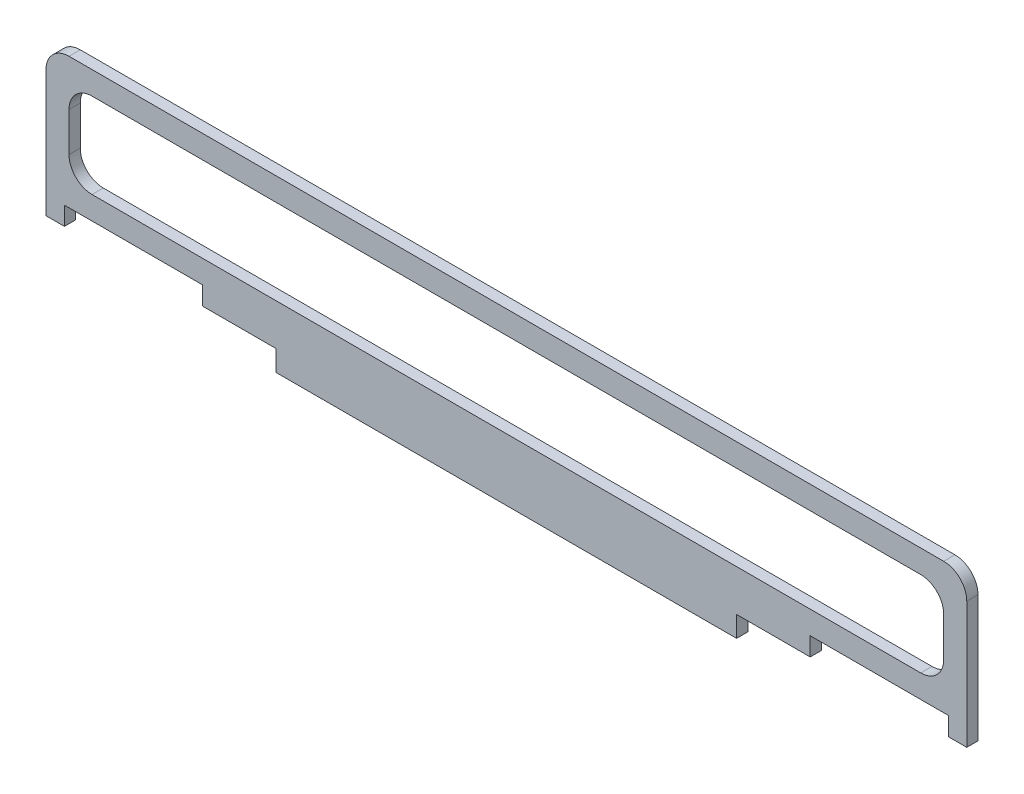
ISO-10303-21;
HEADER;
FILE_DESCRIPTION(('STEP AP214'),'2;1');
FILE_NAME('part.step','',(''),(''),'','','');
FILE_SCHEMA(('AUTOMOTIVE_DESIGN { 1 0 10303 214 1 1 1 1 }'));
ENDSEC;
DATA;
#1=APPLICATION_CONTEXT('core data for automotive mechanical design processes');
#2=APPLICATION_PROTOCOL_DEFINITION('international standard','automotive_design',2000,#1);
#3=PRODUCT_CONTEXT('',#1,'mechanical');
#4=PRODUCT('Part','Part','',(#3));
#5=PRODUCT_RELATED_PRODUCT_CATEGORY('part','',(#4));
#6=PRODUCT_DEFINITION_FORMATION('','',#4);
#7=PRODUCT_DEFINITION_CONTEXT('part definition',#1,'design');
#8=PRODUCT_DEFINITION('design','',#6,#7);
#9=PRODUCT_DEFINITION_SHAPE('','',#8);
#10=(LENGTH_UNIT() NAMED_UNIT(*) SI_UNIT(.MILLI.,.METRE.));
#11=(NAMED_UNIT(*) PLANE_ANGLE_UNIT() SI_UNIT($,.RADIAN.));
#12=(NAMED_UNIT(*) SI_UNIT($,.STERADIAN.) SOLID_ANGLE_UNIT());
#13=UNCERTAINTY_MEASURE_WITH_UNIT(LENGTH_MEASURE(1.E-05),#10,'distance_accuracy_value','');
#14=(GEOMETRIC_REPRESENTATION_CONTEXT(3) GLOBAL_UNCERTAINTY_ASSIGNED_CONTEXT((#13)) GLOBAL_UNIT_ASSIGNED_CONTEXT((#10,
#11,#12)) REPRESENTATION_CONTEXT('',''));
#15=CARTESIAN_POINT('',(0.,0.,0.));
#16=DIRECTION('',(0.,0.,1.));
#17=DIRECTION('',(1.,0.,0.));
#18=AXIS2_PLACEMENT_3D('',#15,#16,#17);
#19=CARTESIAN_POINT('',(127.,-17.78,0.));
#20=DIRECTION('',(0.,1.,0.));
#21=DIRECTION('',(0.,0.,1.));
#22=AXIS2_PLACEMENT_3D('',#19,#20,#21);
#23=PLANE('',#22);
#24=DIRECTION('',(-1.,0.,0.));
#25=VECTOR('',#24,1.);
#26=CARTESIAN_POINT('',(127.,-17.78,0.));
#27=LINE('',#26,#25);
#28=CARTESIAN_POINT('',(83.82,-17.78,0.));
#29=VERTEX_POINT('',#28);
#30=CARTESIAN_POINT('',(63.5,-17.78,0.));
#31=VERTEX_POINT('',#30);
#32=EDGE_CURVE('E260',#29,#31,#27,.T.);
#33=ORIENTED_EDGE('',*,*,#32,.F.);
#34=DIRECTION('',(0.,0.,1.));
#35=VECTOR('',#34,1.);
#36=CARTESIAN_POINT('',(83.82,-17.78,0.));
#37=LINE('',#36,#35);
#38=CARTESIAN_POINT('',(83.82,-17.78,3.0988));
#39=VERTEX_POINT('',#38);
#40=EDGE_CURVE('E388',#29,#39,#37,.T.);
#41=ORIENTED_EDGE('',*,*,#40,.T.);
#42=DIRECTION('',(-1.,0.,0.));
#43=VECTOR('',#42,1.);
#44=CARTESIAN_POINT('',(127.,-17.78,3.0988));
#45=LINE('',#44,#43);
#46=CARTESIAN_POINT('',(63.5,-17.78,3.0988));
#47=VERTEX_POINT('',#46);
#48=EDGE_CURVE('E268',#39,#47,#45,.T.);
#49=ORIENTED_EDGE('',*,*,#48,.T.);
#50=DIRECTION('',(0.,0.,1.));
#51=VECTOR('',#50,1.);
#52=CARTESIAN_POINT('',(63.5,-17.78,0.));
#53=LINE('',#52,#51);
#54=EDGE_CURVE('E272',#31,#47,#53,.T.);
#55=ORIENTED_EDGE('',*,*,#54,.F.);
#56=EDGE_LOOP('',(#33,#41,#49,#55));
#57=FACE_BOUND('',#56,.T.);
#58=ADVANCED_FACE('F33',(#57),#23,.F.);
#59=CARTESIAN_POINT('',(-127.,-17.78,0.));
#60=DIRECTION('',(0.,1.,0.));
#61=DIRECTION('',(0.,0.,1.));
#62=AXIS2_PLACEMENT_3D('',#59,#60,#61);
#63=PLANE('',#62);
#64=DIRECTION('',(-1.,0.,0.));
#65=VECTOR('',#64,1.);
#66=CARTESIAN_POINT('',(-127.,-17.78,0.));
#67=LINE('',#66,#65);
#68=CARTESIAN_POINT('',(-121.92,-17.78,0.));
#69=VERTEX_POINT('',#68);
#70=CARTESIAN_POINT('',(-127.,-17.78,0.));
#71=VERTEX_POINT('',#70);
#72=EDGE_CURVE('E223',#69,#71,#67,.T.);
#73=ORIENTED_EDGE('',*,*,#72,.F.);
#74=DIRECTION('',(0.,0.,1.));
#75=VECTOR('',#74,1.);
#76=CARTESIAN_POINT('',(-121.92,-17.78,0.));
#77=LINE('',#76,#75);
#78=CARTESIAN_POINT('',(-121.92,-17.78,3.0988));
#79=VERTEX_POINT('',#78);
#80=EDGE_CURVE('E207',#69,#79,#77,.T.);
#81=ORIENTED_EDGE('',*,*,#80,.T.);
#82=DIRECTION('',(-1.,0.,0.));
#83=VECTOR('',#82,1.);
#84=CARTESIAN_POINT('',(-127.,-17.78,3.0988));
#85=LINE('',#84,#83);
#86=CARTESIAN_POINT('',(-127.,-17.78,3.0988));
#87=VERTEX_POINT('',#86);
#88=EDGE_CURVE('E247',#79,#87,#85,.T.);
#89=ORIENTED_EDGE('',*,*,#88,.T.);
#90=DIRECTION('',(0.,0.,1.));
#91=VECTOR('',#90,1.);
#92=CARTESIAN_POINT('',(-127.,-17.78,0.));
#93=LINE('',#92,#91);
#94=EDGE_CURVE('E232',#71,#87,#93,.T.);
#95=ORIENTED_EDGE('',*,*,#94,.F.);
#96=EDGE_LOOP('',(#73,#81,#89,#95));
#97=FACE_BOUND('',#96,.T.);
#98=ADVANCED_FACE('F230',(#97),#63,.F.);
#99=CARTESIAN_POINT('',(127.,23.495,3.0988));
#100=DIRECTION('',(-1.,0.,0.));
#101=DIRECTION('',(0.,0.,1.));
#102=AXIS2_PLACEMENT_3D('',#99,#100,#101);
#103=PLANE('',#102);
#104=DIRECTION('',(0.,1.,0.));
#105=VECTOR('',#104,1.);
#106=CARTESIAN_POINT('',(127.,23.495,3.0988));
#107=LINE('',#106,#105);
#108=CARTESIAN_POINT('',(127.,-17.78,3.0988));
#109=VERTEX_POINT('',#108);
#110=CARTESIAN_POINT('',(127.,17.145,3.0988));
#111=VERTEX_POINT('',#110);
#112=EDGE_CURVE('E276',#109,#111,#107,.T.);
#113=ORIENTED_EDGE('',*,*,#112,.F.);
#114=DIRECTION('',(0.,0.,1.));
#115=VECTOR('',#114,1.);
#116=CARTESIAN_POINT('',(127.,-17.78,0.));
#117=LINE('',#116,#115);
#118=CARTESIAN_POINT('',(127.,-17.78,0.));
#119=VERTEX_POINT('',#118);
#120=EDGE_CURVE('E263',#119,#109,#117,.T.);
#121=ORIENTED_EDGE('',*,*,#120,.F.);
#122=DIRECTION('',(0.,1.,0.));
#123=VECTOR('',#122,1.);
#124=CARTESIAN_POINT('',(127.,23.495,0.));
#125=LINE('',#124,#123);
#126=CARTESIAN_POINT('',(127.,17.145,0.));
#127=VERTEX_POINT('',#126);
#128=EDGE_CURVE('E252',#119,#127,#125,.T.);
#129=ORIENTED_EDGE('',*,*,#128,.T.);
#130=DIRECTION('',(0.,0.,-1.));
#131=VECTOR('',#130,1.);
#132=CARTESIAN_POINT('',(127.,17.145,3.0988));
#133=LINE('',#132,#131);
#134=EDGE_CURVE('E306',#127,#111,#133,.F.);
#135=ORIENTED_EDGE('',*,*,#134,.T.);
#136=EDGE_LOOP('',(#113,#121,#129,#135));
#137=FACE_BOUND('',#136,.T.);
#138=ADVANCED_FACE('F433',(#137),#103,.F.);
#139=CARTESIAN_POINT('',(-127.,23.495,3.0988));
#140=DIRECTION('',(0.,-1.,0.));
#141=DIRECTION('',(0.,0.,-1.));
#142=AXIS2_PLACEMENT_3D('',#139,#140,#141);
#143=PLANE('',#142);
#144=DIRECTION('',(-1.,0.,0.));
#145=VECTOR('',#144,1.);
#146=CARTESIAN_POINT('',(-127.,23.495,3.0988));
#147=LINE('',#146,#145);
#148=CARTESIAN_POINT('',(120.65,23.495,3.0988));
#149=VERTEX_POINT('',#148);
#150=CARTESIAN_POINT('',(-120.65,23.495,3.0988));
#151=VERTEX_POINT('',#150);
#152=EDGE_CURVE('E278',#149,#151,#147,.T.);
#153=ORIENTED_EDGE('',*,*,#152,.F.);
#154=DIRECTION('',(0.,0.,-1.));
#155=VECTOR('',#154,1.);
#156=CARTESIAN_POINT('',(120.65,23.495,3.0988));
#157=LINE('',#156,#155);
#158=CARTESIAN_POINT('',(120.65,23.495,0.));
#159=VERTEX_POINT('',#158);
#160=EDGE_CURVE('E298',#149,#159,#157,.T.);
#161=ORIENTED_EDGE('',*,*,#160,.T.);
#162=DIRECTION('',(-1.,0.,0.));
#163=VECTOR('',#162,1.);
#164=CARTESIAN_POINT('',(-127.,23.495,0.));
#165=LINE('',#164,#163);
#166=CARTESIAN_POINT('',(-120.65,23.495,0.));
#167=VERTEX_POINT('',#166);
#168=EDGE_CURVE('E290',#159,#167,#165,.T.);
#169=ORIENTED_EDGE('',*,*,#168,.T.);
#170=DIRECTION('',(0.,0.,-1.));
#171=VECTOR('',#170,1.);
#172=CARTESIAN_POINT('',(-120.65,23.495,3.0988));
#173=LINE('',#172,#171);
#174=EDGE_CURVE('E288',#167,#151,#173,.F.);
#175=ORIENTED_EDGE('',*,*,#174,.T.);
#176=EDGE_LOOP('',(#153,#161,#169,#175));
#177=FACE_BOUND('',#176,.T.);
#178=ADVANCED_FACE('F443',(#177),#143,.F.);
#179=CARTESIAN_POINT('',(-127.,23.495,3.0988));
#180=DIRECTION('',(1.,0.,0.));
#181=DIRECTION('',(0.,0.,-1.));
#182=AXIS2_PLACEMENT_3D('',#179,#180,#181);
#183=PLANE('',#182);
#184=DIRECTION('',(0.,-1.,0.));
#185=VECTOR('',#184,1.);
#186=CARTESIAN_POINT('',(-127.,23.495,0.));
#187=LINE('',#186,#185);
#188=CARTESIAN_POINT('',(-127.,17.145,0.));
#189=VERTEX_POINT('',#188);
#190=EDGE_CURVE('E293',#189,#71,#187,.T.);
#191=ORIENTED_EDGE('',*,*,#190,.T.);
#192=ORIENTED_EDGE('',*,*,#94,.T.);
#193=DIRECTION('',(0.,-1.,0.));
#194=VECTOR('',#193,1.);
#195=CARTESIAN_POINT('',(-127.,23.495,3.0988));
#196=LINE('',#195,#194);
#197=CARTESIAN_POINT('',(-127.,17.145,3.0988));
#198=VERTEX_POINT('',#197);
#199=EDGE_CURVE('E282',#198,#87,#196,.T.);
#200=ORIENTED_EDGE('',*,*,#199,.F.);
#201=DIRECTION('',(0.,0.,-1.));
#202=VECTOR('',#201,1.);
#203=CARTESIAN_POINT('',(-127.,17.145,3.0988));
#204=LINE('',#203,#202);
#205=EDGE_CURVE('E313',#198,#189,#204,.T.);
#206=ORIENTED_EDGE('',*,*,#205,.T.);
#207=EDGE_LOOP('',(#191,#192,#200,#206));
#208=FACE_BOUND('',#207,.T.);
#209=ADVANCED_FACE('F450',(#208),#183,.F.);
#210=CARTESIAN_POINT('',(-127.,-23.495,3.0988));
#211=DIRECTION('',(0.,1.,0.));
#212=DIRECTION('',(0.,0.,1.));
#213=AXIS2_PLACEMENT_3D('',#210,#211,#212);
#214=PLANE('',#213);
#215=DIRECTION('',(1.,0.,0.));
#216=VECTOR('',#215,1.);
#217=CARTESIAN_POINT('',(-127.,-23.495,3.0988));
#218=LINE('',#217,#216);
#219=CARTESIAN_POINT('',(-63.5,-23.495,3.0988));
#220=VERTEX_POINT('',#219);
#221=CARTESIAN_POINT('',(63.5,-23.495,3.0988));
#222=VERTEX_POINT('',#221);
#223=EDGE_CURVE('E285',#220,#222,#218,.T.);
#224=ORIENTED_EDGE('',*,*,#223,.F.);
#225=DIRECTION('',(0.,0.,1.));
#226=VECTOR('',#225,1.);
#227=CARTESIAN_POINT('',(-63.5,-23.495,0.));
#228=LINE('',#227,#226);
#229=CARTESIAN_POINT('',(-63.5,-23.495,0.));
#230=VERTEX_POINT('',#229);
#231=EDGE_CURVE('E238',#230,#220,#228,.T.);
#232=ORIENTED_EDGE('',*,*,#231,.F.);
#233=DIRECTION('',(1.,0.,0.));
#234=VECTOR('',#233,1.);
#235=CARTESIAN_POINT('',(-127.,-23.495,0.));
#236=LINE('',#235,#234);
#237=CARTESIAN_POINT('',(63.5,-23.495,0.));
#238=VERTEX_POINT('',#237);
#239=EDGE_CURVE('E279',#230,#238,#236,.T.);
#240=ORIENTED_EDGE('',*,*,#239,.T.);
#241=DIRECTION('',(0.,0.,1.));
#242=VECTOR('',#241,1.);
#243=CARTESIAN_POINT('',(63.5,-23.495,0.));
#244=LINE('',#243,#242);
#245=EDGE_CURVE('E248',#238,#222,#244,.T.);
#246=ORIENTED_EDGE('',*,*,#245,.T.);
#247=EDGE_LOOP('',(#224,#232,#240,#246));
#248=FACE_BOUND('',#247,.T.);
#249=ADVANCED_FACE('F452',(#248),#214,.F.);
#250=CARTESIAN_POINT('',(0.,0.,3.0988));
#251=DIRECTION('',(0.,0.,1.));
#252=DIRECTION('',(1.,0.,0.));
#253=AXIS2_PLACEMENT_3D('',#250,#251,#252);
#254=PLANE('',#253);
#255=DIRECTION('',(-1.,0.,0.));
#256=VECTOR('',#255,1.);
#257=CARTESIAN_POINT('',(120.65,17.145,3.0988));
#258=LINE('',#257,#256);
#259=CARTESIAN_POINT('',(114.3,17.145,3.0988));
#260=VERTEX_POINT('',#259);
#261=CARTESIAN_POINT('',(-114.3,17.145,3.0988));
#262=VERTEX_POINT('',#261);
#263=EDGE_CURVE('E358',#260,#262,#258,.T.);
#264=ORIENTED_EDGE('',*,*,#263,.F.);
#265=CARTESIAN_POINT('',(114.3,10.795,3.0988));
#266=DIRECTION('',(0.,0.,1.));
#267=DIRECTION('',(1.,0.,0.));
#268=AXIS2_PLACEMENT_3D('',#265,#266,#267);
#269=CIRCLE('',#268,6.35);
#270=CARTESIAN_POINT('',(120.65,10.795,3.0988));
#271=VERTEX_POINT('',#270);
#272=EDGE_CURVE('E339',#260,#271,#269,.F.);
#273=ORIENTED_EDGE('',*,*,#272,.T.);
#274=DIRECTION('',(0.,1.,0.));
#275=VECTOR('',#274,1.);
#276=CARTESIAN_POINT('',(120.65,-6.35,3.0988));
#277=LINE('',#276,#275);
#278=CARTESIAN_POINT('',(120.65,0.,3.0988));
#279=VERTEX_POINT('',#278);
#280=EDGE_CURVE('E381',#279,#271,#277,.T.);
#281=ORIENTED_EDGE('',*,*,#280,.F.);
#282=CARTESIAN_POINT('',(114.3,0.,3.0988));
#283=DIRECTION('',(0.,0.,1.));
#284=DIRECTION('',(1.,0.,0.));
#285=AXIS2_PLACEMENT_3D('',#282,#283,#284);
#286=CIRCLE('',#285,6.35);
#287=CARTESIAN_POINT('',(114.3,-6.35,3.0988));
#288=VERTEX_POINT('',#287);
#289=EDGE_CURVE('E335',#279,#288,#286,.F.);
#290=ORIENTED_EDGE('',*,*,#289,.T.);
#291=DIRECTION('',(1.,0.,0.));
#292=VECTOR('',#291,1.);
#293=CARTESIAN_POINT('',(77.47,-6.35,3.0988));
#294=LINE('',#293,#292);
#295=CARTESIAN_POINT('',(-114.3,-6.35,3.0988));
#296=VERTEX_POINT('',#295);
#297=EDGE_CURVE('E353',#296,#288,#294,.T.);
#298=ORIENTED_EDGE('',*,*,#297,.F.);
#299=CARTESIAN_POINT('',(-114.3,0.,3.0988));
#300=DIRECTION('',(0.,0.,1.));
#301=DIRECTION('',(1.,0.,0.));
#302=AXIS2_PLACEMENT_3D('',#299,#300,#301);
#303=CIRCLE('',#302,6.35);
#304=CARTESIAN_POINT('',(-120.65,0.,3.0988));
#305=VERTEX_POINT('',#304);
#306=EDGE_CURVE('E41',#296,#305,#303,.F.);
#307=ORIENTED_EDGE('',*,*,#306,.T.);
#308=DIRECTION('',(0.,-1.,0.));
#309=VECTOR('',#308,1.);
#310=CARTESIAN_POINT('',(-120.65,17.145,3.0988));
#311=LINE('',#310,#309);
#312=CARTESIAN_POINT('',(-120.65,10.795,3.0988));
#313=VERTEX_POINT('',#312);
#314=EDGE_CURVE('E351',#313,#305,#311,.T.);
#315=ORIENTED_EDGE('',*,*,#314,.F.);
#316=CARTESIAN_POINT('',(-114.3,10.795,3.0988));
#317=DIRECTION('',(0.,0.,1.));
#318=DIRECTION('',(1.,0.,0.));
#319=AXIS2_PLACEMENT_3D('',#316,#317,#318);
#320=CIRCLE('',#319,6.35);
#321=EDGE_CURVE('E343',#313,#262,#320,.F.);
#322=ORIENTED_EDGE('',*,*,#321,.T.);
#323=EDGE_LOOP('',(#264,#273,#281,#290,#298,#307,#315,#322));
#324=FACE_BOUND('',#323,.T.);
#325=DIRECTION('',(0.,-1.,0.));
#326=VECTOR('',#325,1.);
#327=CARTESIAN_POINT('',(-121.92,-17.78,3.0988));
#328=LINE('',#327,#326);
#329=CARTESIAN_POINT('',(-121.92,-12.7,3.0988));
#330=VERTEX_POINT('',#329);
#331=EDGE_CURVE('E213',#330,#79,#328,.T.);
#332=ORIENTED_EDGE('',*,*,#331,.F.);
#333=DIRECTION('',(-1.,0.,0.));
#334=VECTOR('',#333,1.);
#335=CARTESIAN_POINT('',(-121.92,-12.7,3.0988));
#336=LINE('',#335,#334);
#337=CARTESIAN_POINT('',(-83.82,-12.7,3.0988));
#338=VERTEX_POINT('',#337);
#339=EDGE_CURVE('E228',#338,#330,#336,.T.);
#340=ORIENTED_EDGE('',*,*,#339,.F.);
#341=DIRECTION('',(0.,1.,0.));
#342=VECTOR('',#341,1.);
#343=CARTESIAN_POINT('',(-83.82,-17.78,3.0988));
#344=LINE('',#343,#342);
#345=CARTESIAN_POINT('',(-83.82,-17.78,3.0988));
#346=VERTEX_POINT('',#345);
#347=EDGE_CURVE('E387',#346,#338,#344,.T.);
#348=ORIENTED_EDGE('',*,*,#347,.F.);
#349=CARTESIAN_POINT('',(-63.5,-17.78,3.0988));
#350=VERTEX_POINT('',#349);
#351=EDGE_CURVE('E240',#350,#346,#85,.T.);
#352=ORIENTED_EDGE('',*,*,#351,.F.);
#353=DIRECTION('',(0.,1.,0.));
#354=VECTOR('',#353,1.);
#355=CARTESIAN_POINT('',(-63.5,-23.495,3.0988));
#356=LINE('',#355,#354);
#357=EDGE_CURVE('E244',#220,#350,#356,.T.);
#358=ORIENTED_EDGE('',*,*,#357,.F.);
#359=ORIENTED_EDGE('',*,*,#223,.T.);
#360=DIRECTION('',(0.,-1.,0.));
#361=VECTOR('',#360,1.);
#362=CARTESIAN_POINT('',(63.5,-23.495,3.0988));
#363=LINE('',#362,#361);
#364=EDGE_CURVE('E267',#47,#222,#363,.T.);
#365=ORIENTED_EDGE('',*,*,#364,.F.);
#366=ORIENTED_EDGE('',*,*,#48,.F.);
#367=DIRECTION('',(0.,-1.,0.));
#368=VECTOR('',#367,1.);
#369=CARTESIAN_POINT('',(83.82,-17.78,3.0988));
#370=LINE('',#369,#368);
#371=CARTESIAN_POINT('',(83.82,-12.7,3.0988));
#372=VERTEX_POINT('',#371);
#373=EDGE_CURVE('E402',#372,#39,#370,.T.);
#374=ORIENTED_EDGE('',*,*,#373,.F.);
#375=DIRECTION('',(-1.,0.,0.));
#376=VECTOR('',#375,1.);
#377=CARTESIAN_POINT('',(121.92,-12.7,3.0988));
#378=LINE('',#377,#376);
#379=CARTESIAN_POINT('',(121.92,-12.7,3.0988));
#380=VERTEX_POINT('',#379);
#381=EDGE_CURVE('E411',#380,#372,#378,.T.);
#382=ORIENTED_EDGE('',*,*,#381,.F.);
#383=DIRECTION('',(0.,1.,0.));
#384=VECTOR('',#383,1.);
#385=CARTESIAN_POINT('',(121.92,-17.78,3.0988));
#386=LINE('',#385,#384);
#387=CARTESIAN_POINT('',(121.92,-17.78,3.0988));
#388=VERTEX_POINT('',#387);
#389=EDGE_CURVE('E372',#388,#380,#386,.T.);
#390=ORIENTED_EDGE('',*,*,#389,.F.);
#391=EDGE_CURVE('E264',#109,#388,#45,.T.);
#392=ORIENTED_EDGE('',*,*,#391,.F.);
#393=ORIENTED_EDGE('',*,*,#112,.T.);
#394=CARTESIAN_POINT('',(120.65,17.145,3.0988));
#395=DIRECTION('',(0.,0.,1.));
#396=DIRECTION('',(1.,0.,0.));
#397=AXIS2_PLACEMENT_3D('',#394,#395,#396);
#398=CIRCLE('',#397,6.35);
#399=EDGE_CURVE('E311',#111,#149,#398,.T.);
#400=ORIENTED_EDGE('',*,*,#399,.T.);
#401=ORIENTED_EDGE('',*,*,#152,.T.);
#402=CARTESIAN_POINT('',(-120.65,17.145,3.0988));
#403=DIRECTION('',(0.,0.,1.));
#404=DIRECTION('',(1.,0.,0.));
#405=AXIS2_PLACEMENT_3D('',#402,#403,#404);
#406=CIRCLE('',#405,6.35);
#407=EDGE_CURVE('E309',#151,#198,#406,.T.);
#408=ORIENTED_EDGE('',*,*,#407,.T.);
#409=ORIENTED_EDGE('',*,*,#199,.T.);
#410=ORIENTED_EDGE('',*,*,#88,.F.);
#411=EDGE_LOOP('',(#332,#340,#348,#352,#358,#359,#365,#366,#374,#382,#390,#392,#393,#400,#401,
#408,#409,#410));
#412=FACE_BOUND('',#411,.T.);
#413=ADVANCED_FACE('F349',(#324,#412),#254,.T.);
#414=CARTESIAN_POINT('',(0.,0.,0.));
#415=DIRECTION('',(0.,0.,1.));
#416=DIRECTION('',(1.,0.,0.));
#417=AXIS2_PLACEMENT_3D('',#414,#415,#416);
#418=PLANE('',#417);
#419=DIRECTION('',(1.,0.,0.));
#420=VECTOR('',#419,1.);
#421=CARTESIAN_POINT('',(-120.65,-6.35,0.));
#422=LINE('',#421,#420);
#423=CARTESIAN_POINT('',(-114.3,-6.35,0.));
#424=VERTEX_POINT('',#423);
#425=CARTESIAN_POINT('',(114.3,-6.34999999999999,0.));
#426=VERTEX_POINT('',#425);
#427=EDGE_CURVE('E363',#424,#426,#422,.T.);
#428=ORIENTED_EDGE('',*,*,#427,.T.);
#429=CARTESIAN_POINT('',(114.3,0.,0.));
#430=DIRECTION('',(0.,0.,1.));
#431=DIRECTION('',(1.,0.,0.));
#432=AXIS2_PLACEMENT_3D('',#429,#430,#431);
#433=CIRCLE('',#432,6.35);
#434=CARTESIAN_POINT('',(120.65,0.,0.));
#435=VERTEX_POINT('',#434);
#436=EDGE_CURVE('E337',#426,#435,#433,.T.);
#437=ORIENTED_EDGE('',*,*,#436,.T.);
#438=DIRECTION('',(0.,1.,0.));
#439=VECTOR('',#438,1.);
#440=CARTESIAN_POINT('',(120.65,-6.35,0.));
#441=LINE('',#440,#439);
#442=CARTESIAN_POINT('',(120.65,10.795,0.));
#443=VERTEX_POINT('',#442);
#444=EDGE_CURVE('E369',#435,#443,#441,.T.);
#445=ORIENTED_EDGE('',*,*,#444,.T.);
#446=CARTESIAN_POINT('',(114.3,10.795,0.));
#447=DIRECTION('',(0.,0.,1.));
#448=DIRECTION('',(1.,0.,0.));
#449=AXIS2_PLACEMENT_3D('',#446,#447,#448);
#450=CIRCLE('',#449,6.35);
#451=CARTESIAN_POINT('',(114.3,17.145,0.));
#452=VERTEX_POINT('',#451);
#453=EDGE_CURVE('E341',#443,#452,#450,.T.);
#454=ORIENTED_EDGE('',*,*,#453,.T.);
#455=DIRECTION('',(-1.,0.,0.));
#456=VECTOR('',#455,1.);
#457=CARTESIAN_POINT('',(120.65,17.145,0.));
#458=LINE('',#457,#456);
#459=CARTESIAN_POINT('',(-114.3,17.145,0.));
#460=VERTEX_POINT('',#459);
#461=EDGE_CURVE('E374',#452,#460,#458,.T.);
#462=ORIENTED_EDGE('',*,*,#461,.T.);
#463=CARTESIAN_POINT('',(-114.3,10.795,0.));
#464=DIRECTION('',(0.,0.,1.));
#465=DIRECTION('',(1.,0.,0.));
#466=AXIS2_PLACEMENT_3D('',#463,#464,#465);
#467=CIRCLE('',#466,6.35);
#468=CARTESIAN_POINT('',(-120.65,10.795,0.));
#469=VERTEX_POINT('',#468);
#470=EDGE_CURVE('E55',#460,#469,#467,.T.);
#471=ORIENTED_EDGE('',*,*,#470,.T.);
#472=DIRECTION('',(0.,-1.,0.));
#473=VECTOR('',#472,1.);
#474=CARTESIAN_POINT('',(-120.65,17.145,0.));
#475=LINE('',#474,#473);
#476=CARTESIAN_POINT('',(-120.65,0.,0.));
#477=VERTEX_POINT('',#476);
#478=EDGE_CURVE('E365',#469,#477,#475,.T.);
#479=ORIENTED_EDGE('',*,*,#478,.T.);
#480=CARTESIAN_POINT('',(-114.3,0.,0.));
#481=DIRECTION('',(0.,0.,1.));
#482=DIRECTION('',(1.,0.,0.));
#483=AXIS2_PLACEMENT_3D('',#480,#481,#482);
#484=CIRCLE('',#483,6.35);
#485=EDGE_CURVE('E11',#477,#424,#484,.T.);
#486=ORIENTED_EDGE('',*,*,#485,.T.);
#487=EDGE_LOOP('',(#428,#437,#445,#454,#462,#471,#479,#486));
#488=FACE_BOUND('',#487,.T.);
#489=DIRECTION('',(-1.,0.,0.));
#490=VECTOR('',#489,1.);
#491=CARTESIAN_POINT('',(-121.92,-12.7,0.));
#492=LINE('',#491,#490);
#493=CARTESIAN_POINT('',(-83.82,-12.7,0.));
#494=VERTEX_POINT('',#493);
#495=CARTESIAN_POINT('',(-121.92,-12.7,0.));
#496=VERTEX_POINT('',#495);
#497=EDGE_CURVE('E218',#494,#496,#492,.T.);
#498=ORIENTED_EDGE('',*,*,#497,.T.);
#499=DIRECTION('',(0.,-1.,0.));
#500=VECTOR('',#499,1.);
#501=CARTESIAN_POINT('',(-121.92,-17.78,0.));
#502=LINE('',#501,#500);
#503=EDGE_CURVE('E210',#496,#69,#502,.T.);
#504=ORIENTED_EDGE('',*,*,#503,.T.);
#505=ORIENTED_EDGE('',*,*,#72,.T.);
#506=ORIENTED_EDGE('',*,*,#190,.F.);
#507=CARTESIAN_POINT('',(-120.65,17.145,0.));
#508=DIRECTION('',(0.,0.,1.));
#509=DIRECTION('',(1.,0.,0.));
#510=AXIS2_PLACEMENT_3D('',#507,#508,#509);
#511=CIRCLE('',#510,6.35);
#512=EDGE_CURVE('E301',#189,#167,#511,.F.);
#513=ORIENTED_EDGE('',*,*,#512,.T.);
#514=ORIENTED_EDGE('',*,*,#168,.F.);
#515=CARTESIAN_POINT('',(120.65,17.145,0.));
#516=DIRECTION('',(0.,0.,1.));
#517=DIRECTION('',(1.,0.,0.));
#518=AXIS2_PLACEMENT_3D('',#515,#516,#517);
#519=CIRCLE('',#518,6.35);
#520=EDGE_CURVE('E303',#159,#127,#519,.F.);
#521=ORIENTED_EDGE('',*,*,#520,.T.);
#522=ORIENTED_EDGE('',*,*,#128,.F.);
#523=CARTESIAN_POINT('',(121.92,-17.78,0.));
#524=VERTEX_POINT('',#523);
#525=EDGE_CURVE('E256',#119,#524,#27,.T.);
#526=ORIENTED_EDGE('',*,*,#525,.T.);
#527=DIRECTION('',(0.,1.,0.));
#528=VECTOR('',#527,1.);
#529=CARTESIAN_POINT('',(121.92,-17.78,0.));
#530=LINE('',#529,#528);
#531=CARTESIAN_POINT('',(121.92,-12.7,0.));
#532=VERTEX_POINT('',#531);
#533=EDGE_CURVE('E398',#524,#532,#530,.T.);
#534=ORIENTED_EDGE('',*,*,#533,.T.);
#535=DIRECTION('',(-1.,0.,0.));
#536=VECTOR('',#535,1.);
#537=CARTESIAN_POINT('',(121.92,-12.7,0.));
#538=LINE('',#537,#536);
#539=CARTESIAN_POINT('',(83.82,-12.7,0.));
#540=VERTEX_POINT('',#539);
#541=EDGE_CURVE('E401',#532,#540,#538,.T.);
#542=ORIENTED_EDGE('',*,*,#541,.T.);
#543=DIRECTION('',(0.,-1.,0.));
#544=VECTOR('',#543,1.);
#545=CARTESIAN_POINT('',(83.82,-17.78,0.));
#546=LINE('',#545,#544);
#547=EDGE_CURVE('E405',#540,#29,#546,.T.);
#548=ORIENTED_EDGE('',*,*,#547,.T.);
#549=ORIENTED_EDGE('',*,*,#32,.T.);
#550=DIRECTION('',(0.,-1.,0.));
#551=VECTOR('',#550,1.);
#552=CARTESIAN_POINT('',(63.5,-23.495,0.));
#553=LINE('',#552,#551);
#554=EDGE_CURVE('E259',#31,#238,#553,.T.);
#555=ORIENTED_EDGE('',*,*,#554,.T.);
#556=ORIENTED_EDGE('',*,*,#239,.F.);
#557=DIRECTION('',(0.,1.,0.));
#558=VECTOR('',#557,1.);
#559=CARTESIAN_POINT('',(-63.5,-23.495,0.));
#560=LINE('',#559,#558);
#561=CARTESIAN_POINT('',(-63.5,-17.78,0.));
#562=VERTEX_POINT('',#561);
#563=EDGE_CURVE('E235',#230,#562,#560,.T.);
#564=ORIENTED_EDGE('',*,*,#563,.T.);
#565=CARTESIAN_POINT('',(-83.82,-17.78,0.));
#566=VERTEX_POINT('',#565);
#567=EDGE_CURVE('E234',#562,#566,#67,.T.);
#568=ORIENTED_EDGE('',*,*,#567,.T.);
#569=DIRECTION('',(0.,1.,0.));
#570=VECTOR('',#569,1.);
#571=CARTESIAN_POINT('',(-83.82,-17.78,0.));
#572=LINE('',#571,#570);
#573=EDGE_CURVE('E227',#566,#494,#572,.T.);
#574=ORIENTED_EDGE('',*,*,#573,.T.);
#575=EDGE_LOOP('',(#498,#504,#505,#506,#513,#514,#521,#522,#526,#534,#542,#548,#549,#555,#556,
#564,#568,#574));
#576=FACE_BOUND('',#575,.T.);
#577=ADVANCED_FACE('F221',(#488,#576),#418,.F.);
#578=CARTESIAN_POINT('',(120.65,17.145,3.0988));
#579=DIRECTION('',(0.,0.,-1.));
#580=DIRECTION('',(-1.,0.,0.));
#581=AXIS2_PLACEMENT_3D('',#578,#579,#580);
#582=CYLINDRICAL_SURFACE('',#581,6.35);
#583=ORIENTED_EDGE('',*,*,#399,.F.);
#584=ORIENTED_EDGE('',*,*,#134,.F.);
#585=ORIENTED_EDGE('',*,*,#520,.F.);
#586=ORIENTED_EDGE('',*,*,#160,.F.);
#587=EDGE_LOOP('',(#583,#584,#585,#586));
#588=FACE_BOUND('',#587,.T.);
#589=ADVANCED_FACE('F439',(#588),#582,.T.);
#590=CARTESIAN_POINT('',(-120.65,17.145,3.0988));
#591=DIRECTION('',(0.,0.,-1.));
#592=DIRECTION('',(-1.,0.,0.));
#593=AXIS2_PLACEMENT_3D('',#590,#591,#592);
#594=CYLINDRICAL_SURFACE('',#593,6.35);
#595=ORIENTED_EDGE('',*,*,#407,.F.);
#596=ORIENTED_EDGE('',*,*,#174,.F.);
#597=ORIENTED_EDGE('',*,*,#512,.F.);
#598=ORIENTED_EDGE('',*,*,#205,.F.);
#599=EDGE_LOOP('',(#595,#596,#597,#598));
#600=FACE_BOUND('',#599,.T.);
#601=ADVANCED_FACE('F446',(#600),#594,.T.);
#602=CARTESIAN_POINT('',(63.5,-23.495,0.));
#603=DIRECTION('',(-1.,0.,0.));
#604=DIRECTION('',(0.,0.,1.));
#605=AXIS2_PLACEMENT_3D('',#602,#603,#604);
#606=PLANE('',#605);
#607=ORIENTED_EDGE('',*,*,#364,.T.);
#608=ORIENTED_EDGE('',*,*,#245,.F.);
#609=ORIENTED_EDGE('',*,*,#554,.F.);
#610=ORIENTED_EDGE('',*,*,#54,.T.);
#611=EDGE_LOOP('',(#607,#608,#609,#610));
#612=FACE_BOUND('',#611,.T.);
#613=ADVANCED_FACE('F473',(#612),#606,.F.);
#614=ORIENTED_EDGE('',*,*,#391,.T.);
#615=DIRECTION('',(0.,0.,1.));
#616=VECTOR('',#615,1.);
#617=CARTESIAN_POINT('',(121.92,-17.78,0.));
#618=LINE('',#617,#616);
#619=EDGE_CURVE('E408',#524,#388,#618,.T.);
#620=ORIENTED_EDGE('',*,*,#619,.F.);
#621=ORIENTED_EDGE('',*,*,#525,.F.);
#622=ORIENTED_EDGE('',*,*,#120,.T.);
#623=EDGE_LOOP('',(#614,#620,#621,#622));
#624=FACE_BOUND('',#623,.T.);
#625=ADVANCED_FACE('F429',(#624),#23,.F.);
#626=ORIENTED_EDGE('',*,*,#351,.T.);
#627=DIRECTION('',(0.,0.,1.));
#628=VECTOR('',#627,1.);
#629=CARTESIAN_POINT('',(-83.82,-17.78,0.));
#630=LINE('',#629,#628);
#631=EDGE_CURVE('E217',#566,#346,#630,.T.);
#632=ORIENTED_EDGE('',*,*,#631,.F.);
#633=ORIENTED_EDGE('',*,*,#567,.F.);
#634=DIRECTION('',(0.,0.,1.));
#635=VECTOR('',#634,1.);
#636=CARTESIAN_POINT('',(-63.5,-17.78,0.));
#637=LINE('',#636,#635);
#638=EDGE_CURVE('E253',#562,#350,#637,.T.);
#639=ORIENTED_EDGE('',*,*,#638,.T.);
#640=EDGE_LOOP('',(#626,#632,#633,#639));
#641=FACE_BOUND('',#640,.T.);
#642=ADVANCED_FACE('F468',(#641),#63,.F.);
#643=CARTESIAN_POINT('',(-63.5,-23.495,0.));
#644=DIRECTION('',(1.,0.,0.));
#645=DIRECTION('',(0.,0.,-1.));
#646=AXIS2_PLACEMENT_3D('',#643,#644,#645);
#647=PLANE('',#646);
#648=ORIENTED_EDGE('',*,*,#357,.T.);
#649=ORIENTED_EDGE('',*,*,#638,.F.);
#650=ORIENTED_EDGE('',*,*,#563,.F.);
#651=ORIENTED_EDGE('',*,*,#231,.T.);
#652=EDGE_LOOP('',(#648,#649,#650,#651));
#653=FACE_BOUND('',#652,.T.);
#654=ADVANCED_FACE('F478',(#653),#647,.F.);
#655=CARTESIAN_POINT('',(-121.92,-17.78,0.));
#656=DIRECTION('',(-1.,0.,0.));
#657=DIRECTION('',(0.,0.,1.));
#658=AXIS2_PLACEMENT_3D('',#655,#656,#657);
#659=PLANE('',#658);
#660=ORIENTED_EDGE('',*,*,#331,.T.);
#661=ORIENTED_EDGE('',*,*,#80,.F.);
#662=ORIENTED_EDGE('',*,*,#503,.F.);
#663=DIRECTION('',(0.,0.,1.));
#664=VECTOR('',#663,1.);
#665=CARTESIAN_POINT('',(-121.92,-12.7,0.));
#666=LINE('',#665,#664);
#667=EDGE_CURVE('E393',#496,#330,#666,.T.);
#668=ORIENTED_EDGE('',*,*,#667,.T.);
#669=EDGE_LOOP('',(#660,#661,#662,#668));
#670=FACE_BOUND('',#669,.T.);
#671=ADVANCED_FACE('F209',(#670),#659,.F.);
#672=CARTESIAN_POINT('',(-121.92,-12.7,0.));
#673=DIRECTION('',(0.,1.,0.));
#674=DIRECTION('',(0.,0.,1.));
#675=AXIS2_PLACEMENT_3D('',#672,#673,#674);
#676=PLANE('',#675);
#677=ORIENTED_EDGE('',*,*,#339,.T.);
#678=ORIENTED_EDGE('',*,*,#667,.F.);
#679=ORIENTED_EDGE('',*,*,#497,.F.);
#680=DIRECTION('',(0.,0.,1.));
#681=VECTOR('',#680,1.);
#682=CARTESIAN_POINT('',(-83.82,-12.7,0.));
#683=LINE('',#682,#681);
#684=EDGE_CURVE('E395',#494,#338,#683,.T.);
#685=ORIENTED_EDGE('',*,*,#684,.T.);
#686=EDGE_LOOP('',(#677,#678,#679,#685));
#687=FACE_BOUND('',#686,.T.);
#688=ADVANCED_FACE('F503',(#687),#676,.F.);
#689=CARTESIAN_POINT('',(-83.82,-17.78,0.));
#690=DIRECTION('',(1.,0.,0.));
#691=DIRECTION('',(0.,0.,-1.));
#692=AXIS2_PLACEMENT_3D('',#689,#690,#691);
#693=PLANE('',#692);
#694=ORIENTED_EDGE('',*,*,#347,.T.);
#695=ORIENTED_EDGE('',*,*,#684,.F.);
#696=ORIENTED_EDGE('',*,*,#573,.F.);
#697=ORIENTED_EDGE('',*,*,#631,.T.);
#698=EDGE_LOOP('',(#694,#695,#696,#697));
#699=FACE_BOUND('',#698,.T.);
#700=ADVANCED_FACE('F499',(#699),#693,.F.);
#701=CARTESIAN_POINT('',(83.82,-17.78,0.));
#702=DIRECTION('',(-1.,0.,0.));
#703=DIRECTION('',(0.,0.,1.));
#704=AXIS2_PLACEMENT_3D('',#701,#702,#703);
#705=PLANE('',#704);
#706=ORIENTED_EDGE('',*,*,#373,.T.);
#707=ORIENTED_EDGE('',*,*,#40,.F.);
#708=ORIENTED_EDGE('',*,*,#547,.F.);
#709=DIRECTION('',(0.,0.,1.));
#710=VECTOR('',#709,1.);
#711=CARTESIAN_POINT('',(83.82,-12.7,0.));
#712=LINE('',#711,#710);
#713=EDGE_CURVE('E417',#540,#372,#712,.T.);
#714=ORIENTED_EDGE('',*,*,#713,.T.);
#715=EDGE_LOOP('',(#706,#707,#708,#714));
#716=FACE_BOUND('',#715,.T.);
#717=ADVANCED_FACE('F495',(#716),#705,.F.);
#718=CARTESIAN_POINT('',(121.92,-12.7,0.));
#719=DIRECTION('',(0.,1.,0.));
#720=DIRECTION('',(0.,0.,1.));
#721=AXIS2_PLACEMENT_3D('',#718,#719,#720);
#722=PLANE('',#721);
#723=ORIENTED_EDGE('',*,*,#381,.T.);
#724=ORIENTED_EDGE('',*,*,#713,.F.);
#725=ORIENTED_EDGE('',*,*,#541,.F.);
#726=DIRECTION('',(0.,0.,1.));
#727=VECTOR('',#726,1.);
#728=CARTESIAN_POINT('',(121.92,-12.7,0.));
#729=LINE('',#728,#727);
#730=EDGE_CURVE('E419',#532,#380,#729,.T.);
#731=ORIENTED_EDGE('',*,*,#730,.T.);
#732=EDGE_LOOP('',(#723,#724,#725,#731));
#733=FACE_BOUND('',#732,.T.);
#734=ADVANCED_FACE('F492',(#733),#722,.F.);
#735=CARTESIAN_POINT('',(121.92,-17.78,0.));
#736=DIRECTION('',(1.,0.,0.));
#737=DIRECTION('',(0.,0.,-1.));
#738=AXIS2_PLACEMENT_3D('',#735,#736,#737);
#739=PLANE('',#738);
#740=ORIENTED_EDGE('',*,*,#389,.T.);
#741=ORIENTED_EDGE('',*,*,#730,.F.);
#742=ORIENTED_EDGE('',*,*,#533,.F.);
#743=ORIENTED_EDGE('',*,*,#619,.T.);
#744=EDGE_LOOP('',(#740,#741,#742,#743));
#745=FACE_BOUND('',#744,.T.);
#746=ADVANCED_FACE('F423',(#745),#739,.F.);
#747=CARTESIAN_POINT('',(120.65,17.145,0.));
#748=DIRECTION('',(0.,1.,0.));
#749=DIRECTION('',(0.,0.,1.));
#750=AXIS2_PLACEMENT_3D('',#747,#748,#749);
#751=PLANE('',#750);
#752=ORIENTED_EDGE('',*,*,#461,.F.);
#753=DIRECTION('',(0.,0.,1.));
#754=VECTOR('',#753,1.);
#755=CARTESIAN_POINT('',(114.3,17.145,3.0988));
#756=LINE('',#755,#754);
#757=EDGE_CURVE('E328',#452,#260,#756,.T.);
#758=ORIENTED_EDGE('',*,*,#757,.T.);
#759=ORIENTED_EDGE('',*,*,#263,.T.);
#760=DIRECTION('',(0.,0.,1.));
#761=VECTOR('',#760,1.);
#762=CARTESIAN_POINT('',(-114.3,17.145,0.));
#763=LINE('',#762,#761);
#764=EDGE_CURVE('E326',#262,#460,#763,.F.);
#765=ORIENTED_EDGE('',*,*,#764,.T.);
#766=EDGE_LOOP('',(#752,#758,#759,#765));
#767=FACE_BOUND('',#766,.T.);
#768=ADVANCED_FACE('F491',(#767),#751,.F.);
#769=CARTESIAN_POINT('',(120.65,-6.35,0.));
#770=DIRECTION('',(1.,0.,0.));
#771=DIRECTION('',(0.,1.,0.));
#772=AXIS2_PLACEMENT_3D('',#769,#770,#771);
#773=PLANE('',#772);
#774=ORIENTED_EDGE('',*,*,#444,.F.);
#775=DIRECTION('',(0.,0.,1.));
#776=VECTOR('',#775,1.);
#777=CARTESIAN_POINT('',(120.65,0.,3.0988));
#778=LINE('',#777,#776);
#779=EDGE_CURVE('E318',#435,#279,#778,.T.);
#780=ORIENTED_EDGE('',*,*,#779,.T.);
#781=ORIENTED_EDGE('',*,*,#280,.T.);
#782=DIRECTION('',(0.,0.,1.));
#783=VECTOR('',#782,1.);
#784=CARTESIAN_POINT('',(120.65,10.795,0.));
#785=LINE('',#784,#783);
#786=EDGE_CURVE('E316',#271,#443,#785,.F.);
#787=ORIENTED_EDGE('',*,*,#786,.T.);
#788=EDGE_LOOP('',(#774,#780,#781,#787));
#789=FACE_BOUND('',#788,.T.);
#790=ADVANCED_FACE('F512',(#789),#773,.F.);
#791=CARTESIAN_POINT('',(77.47,-6.35,0.));
#792=DIRECTION('',(0.,-1.,0.));
#793=DIRECTION('',(0.,0.,-1.));
#794=AXIS2_PLACEMENT_3D('',#791,#792,#793);
#795=PLANE('',#794);
#796=ORIENTED_EDGE('',*,*,#297,.T.);
#797=DIRECTION('',(0.,0.,1.));
#798=VECTOR('',#797,1.);
#799=CARTESIAN_POINT('',(114.3,-6.35,0.));
#800=LINE('',#799,#798);
#801=EDGE_CURVE('E324',#288,#426,#800,.F.);
#802=ORIENTED_EDGE('',*,*,#801,.T.);
#803=ORIENTED_EDGE('',*,*,#427,.F.);
#804=DIRECTION('',(0.,0.,1.));
#805=VECTOR('',#804,1.);
#806=CARTESIAN_POINT('',(-114.3,-6.35,3.0988));
#807=LINE('',#806,#805);
#808=EDGE_CURVE('E321',#424,#296,#807,.T.);
#809=ORIENTED_EDGE('',*,*,#808,.T.);
#810=EDGE_LOOP('',(#796,#802,#803,#809));
#811=FACE_BOUND('',#810,.T.);
#812=ADVANCED_FACE('F367',(#811),#795,.F.);
#813=CARTESIAN_POINT('',(-120.65,17.145,0.));
#814=DIRECTION('',(-1.,0.,0.));
#815=DIRECTION('',(0.,-1.,0.));
#816=AXIS2_PLACEMENT_3D('',#813,#814,#815);
#817=PLANE('',#816);
#818=ORIENTED_EDGE('',*,*,#478,.F.);
#819=DIRECTION('',(0.,0.,1.));
#820=VECTOR('',#819,1.);
#821=CARTESIAN_POINT('',(-120.65,10.795,3.0988));
#822=LINE('',#821,#820);
#823=EDGE_CURVE('E332',#469,#313,#822,.T.);
#824=ORIENTED_EDGE('',*,*,#823,.T.);
#825=ORIENTED_EDGE('',*,*,#314,.T.);
#826=DIRECTION('',(0.,0.,1.));
#827=VECTOR('',#826,1.);
#828=CARTESIAN_POINT('',(-120.65,0.,0.));
#829=LINE('',#828,#827);
#830=EDGE_CURVE('E48',#305,#477,#829,.F.);
#831=ORIENTED_EDGE('',*,*,#830,.T.);
#832=EDGE_LOOP('',(#818,#824,#825,#831));
#833=FACE_BOUND('',#832,.T.);
#834=ADVANCED_FACE('F356',(#833),#817,.F.);
#835=CARTESIAN_POINT('',(114.3,0.,0.));
#836=DIRECTION('',(0.,0.,-1.));
#837=DIRECTION('',(-1.,0.,0.));
#838=AXIS2_PLACEMENT_3D('',#835,#836,#837);
#839=CYLINDRICAL_SURFACE('',#838,6.35);
#840=ORIENTED_EDGE('',*,*,#436,.F.);
#841=ORIENTED_EDGE('',*,*,#801,.F.);
#842=ORIENTED_EDGE('',*,*,#289,.F.);
#843=ORIENTED_EDGE('',*,*,#779,.F.);
#844=EDGE_LOOP('',(#840,#841,#842,#843));
#845=FACE_BOUND('',#844,.T.);
#846=ADVANCED_FACE('F516',(#845),#839,.F.);
#847=CARTESIAN_POINT('',(114.3,10.795,0.));
#848=DIRECTION('',(0.,0.,-1.));
#849=DIRECTION('',(-1.,0.,0.));
#850=AXIS2_PLACEMENT_3D('',#847,#848,#849);
#851=CYLINDRICAL_SURFACE('',#850,6.35);
#852=ORIENTED_EDGE('',*,*,#453,.F.);
#853=ORIENTED_EDGE('',*,*,#786,.F.);
#854=ORIENTED_EDGE('',*,*,#272,.F.);
#855=ORIENTED_EDGE('',*,*,#757,.F.);
#856=EDGE_LOOP('',(#852,#853,#854,#855));
#857=FACE_BOUND('',#856,.T.);
#858=ADVANCED_FACE('F530',(#857),#851,.F.);
#859=CARTESIAN_POINT('',(-114.3,10.795,0.));
#860=DIRECTION('',(0.,0.,-1.));
#861=DIRECTION('',(-1.,0.,0.));
#862=AXIS2_PLACEMENT_3D('',#859,#860,#861);
#863=CYLINDRICAL_SURFACE('',#862,6.35);
#864=ORIENTED_EDGE('',*,*,#470,.F.);
#865=ORIENTED_EDGE('',*,*,#764,.F.);
#866=ORIENTED_EDGE('',*,*,#321,.F.);
#867=ORIENTED_EDGE('',*,*,#823,.F.);
#868=EDGE_LOOP('',(#864,#865,#866,#867));
#869=FACE_BOUND('',#868,.T.);
#870=ADVANCED_FACE('F535',(#869),#863,.F.);
#871=CARTESIAN_POINT('',(-114.3,0.,0.));
#872=DIRECTION('',(0.,0.,-1.));
#873=DIRECTION('',(-1.,0.,0.));
#874=AXIS2_PLACEMENT_3D('',#871,#872,#873);
#875=CYLINDRICAL_SURFACE('',#874,6.35);
#876=ORIENTED_EDGE('',*,*,#485,.F.);
#877=ORIENTED_EDGE('',*,*,#830,.F.);
#878=ORIENTED_EDGE('',*,*,#306,.F.);
#879=ORIENTED_EDGE('',*,*,#808,.F.);
#880=EDGE_LOOP('',(#876,#877,#878,#879));
#881=FACE_BOUND('',#880,.T.);
#882=ADVANCED_FACE('F35',(#881),#875,.F.);
#883=CLOSED_SHELL('',(#58,#98,#138,#178,#209,#249,#413,#577,#589,#601,#613,#625,#642,#654,#671,
#688,#700,#717,#734,#746,#768,#790,#812,#834,#846,#858,#870,#882));
#884=MANIFOLD_SOLID_BREP('B2',#883);
#885=ADVANCED_BREP_SHAPE_REPRESENTATION('',(#18,#884),#14);
#886=SHAPE_DEFINITION_REPRESENTATION(#9,#885);
ENDSEC;
END-ISO-10303-21;
